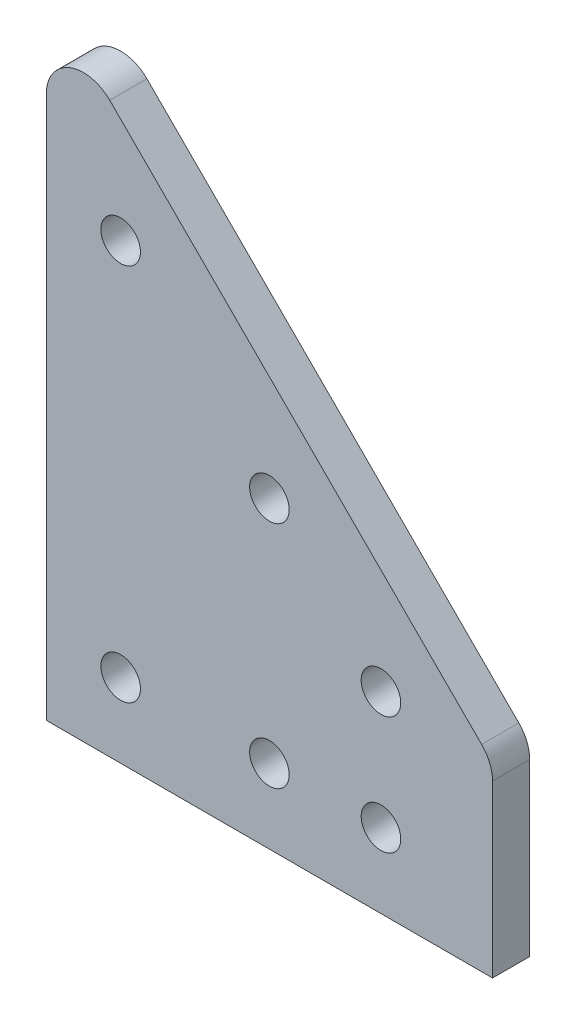
ISO-10303-21;
HEADER;
FILE_DESCRIPTION(('STEP AP214'),'2;1');
FILE_NAME('part.step','',(''),(''),'','','');
FILE_SCHEMA(('AUTOMOTIVE_DESIGN { 1 0 10303 214 1 1 1 1 }'));
ENDSEC;
DATA;
#1=APPLICATION_CONTEXT('core data for automotive mechanical design processes');
#2=APPLICATION_PROTOCOL_DEFINITION('international standard','automotive_design',2000,#1);
#3=PRODUCT_CONTEXT('',#1,'mechanical');
#4=PRODUCT('Part','Part','',(#3));
#5=PRODUCT_RELATED_PRODUCT_CATEGORY('part','',(#4));
#6=PRODUCT_DEFINITION_FORMATION('','',#4);
#7=PRODUCT_DEFINITION_CONTEXT('part definition',#1,'design');
#8=PRODUCT_DEFINITION('design','',#6,#7);
#9=PRODUCT_DEFINITION_SHAPE('','',#8);
#10=(LENGTH_UNIT() NAMED_UNIT(*) SI_UNIT(.MILLI.,.METRE.));
#11=(NAMED_UNIT(*) PLANE_ANGLE_UNIT() SI_UNIT($,.RADIAN.));
#12=(NAMED_UNIT(*) SI_UNIT($,.STERADIAN.) SOLID_ANGLE_UNIT());
#13=UNCERTAINTY_MEASURE_WITH_UNIT(LENGTH_MEASURE(1.E-05),#10,'distance_accuracy_value','');
#14=(GEOMETRIC_REPRESENTATION_CONTEXT(3) GLOBAL_UNCERTAINTY_ASSIGNED_CONTEXT((#13)) GLOBAL_UNIT_ASSIGNED_CONTEXT((#10,
#11,#12)) REPRESENTATION_CONTEXT('',''));
#15=CARTESIAN_POINT('',(0.,0.,0.));
#16=DIRECTION('',(0.,0.,1.));
#17=DIRECTION('',(1.,0.,0.));
#18=AXIS2_PLACEMENT_3D('',#15,#16,#17);
#19=CARTESIAN_POINT('',(-38.1,92.0749999999997,3.175));
#20=DIRECTION('',(1.,0.,0.));
#21=DIRECTION('',(0.,1.,0.));
#22=AXIS2_PLACEMENT_3D('',#19,#20,#21);
#23=PLANE('',#22);
#24=DIRECTION('',(0.,-1.,0.));
#25=VECTOR('',#24,1.);
#26=CARTESIAN_POINT('',(-38.1,92.0749999999997,3.175));
#27=LINE('',#26,#25);
#28=CARTESIAN_POINT('',(-38.1,76.7447438789306,3.175));
#29=VERTEX_POINT('',#28);
#30=CARTESIAN_POINT('',(-38.1,-15.875,3.175));
#31=VERTEX_POINT('',#30);
#32=EDGE_CURVE('E94',#29,#31,#27,.T.);
#33=ORIENTED_EDGE('',*,*,#32,.F.);
#34=DIRECTION('',(0.,0.,-1.));
#35=VECTOR('',#34,1.);
#36=CARTESIAN_POINT('',(-38.1,76.7447438789306,3.175));
#37=LINE('',#36,#35);
#38=CARTESIAN_POINT('',(-38.1,76.7447438789306,-3.175));
#39=VERTEX_POINT('',#38);
#40=EDGE_CURVE('E11',#29,#39,#37,.T.);
#41=ORIENTED_EDGE('',*,*,#40,.T.);
#42=DIRECTION('',(0.,-1.,0.));
#43=VECTOR('',#42,1.);
#44=CARTESIAN_POINT('',(-38.1,92.0749999999997,-3.175));
#45=LINE('',#44,#43);
#46=CARTESIAN_POINT('',(-38.1,-15.875,-3.175));
#47=VERTEX_POINT('',#46);
#48=EDGE_CURVE('E113',#39,#47,#45,.T.);
#49=ORIENTED_EDGE('',*,*,#48,.T.);
#50=DIRECTION('',(0.,0.,-1.));
#51=VECTOR('',#50,1.);
#52=CARTESIAN_POINT('',(-38.1,-15.875,3.175));
#53=LINE('',#52,#51);
#54=EDGE_CURVE('E107',#31,#47,#53,.T.);
#55=ORIENTED_EDGE('',*,*,#54,.F.);
#56=EDGE_LOOP('',(#33,#41,#49,#55));
#57=FACE_BOUND('',#56,.T.);
#58=ADVANCED_FACE('F41',(#57),#23,.F.);
#59=CARTESIAN_POINT('',(-38.1,-15.875,3.175));
#60=DIRECTION('',(0.,1.,0.));
#61=DIRECTION('',(0.,0.,1.));
#62=AXIS2_PLACEMENT_3D('',#59,#60,#61);
#63=PLANE('',#62);
#64=DIRECTION('',(1.,0.,0.));
#65=VECTOR('',#64,1.);
#66=CARTESIAN_POINT('',(-38.1,-15.875,-3.175));
#67=LINE('',#66,#65);
#68=CARTESIAN_POINT('',(38.1,-15.875,-3.175));
#69=VERTEX_POINT('',#68);
#70=EDGE_CURVE('E146',#47,#69,#67,.T.);
#71=ORIENTED_EDGE('',*,*,#70,.T.);
#72=DIRECTION('',(0.,0.,-1.));
#73=VECTOR('',#72,1.);
#74=CARTESIAN_POINT('',(38.1,-15.875,3.175));
#75=LINE('',#74,#73);
#76=CARTESIAN_POINT('',(38.1,-15.875,3.175));
#77=VERTEX_POINT('',#76);
#78=EDGE_CURVE('E109',#77,#69,#75,.T.);
#79=ORIENTED_EDGE('',*,*,#78,.F.);
#80=DIRECTION('',(1.,0.,0.));
#81=VECTOR('',#80,1.);
#82=CARTESIAN_POINT('',(-38.1,-15.875,3.175));
#83=LINE('',#82,#81);
#84=EDGE_CURVE('E97',#31,#77,#83,.T.);
#85=ORIENTED_EDGE('',*,*,#84,.F.);
#86=ORIENTED_EDGE('',*,*,#54,.T.);
#87=EDGE_LOOP('',(#71,#79,#85,#86));
#88=FACE_BOUND('',#87,.T.);
#89=ADVANCED_FACE('F106',(#88),#63,.F.);
#90=CARTESIAN_POINT('',(38.1,-15.875,3.175));
#91=DIRECTION('',(-1.,0.,0.));
#92=DIRECTION('',(0.,0.,1.));
#93=AXIS2_PLACEMENT_3D('',#90,#91,#92);
#94=PLANE('',#93);
#95=DIRECTION('',(0.,1.,0.));
#96=VECTOR('',#95,1.);
#97=CARTESIAN_POINT('',(38.1,-15.875,-3.175));
#98=LINE('',#97,#96);
#99=CARTESIAN_POINT('',(38.1,13.2447438789309,-3.175));
#100=VERTEX_POINT('',#99);
#101=EDGE_CURVE('E144',#69,#100,#98,.T.);
#102=ORIENTED_EDGE('',*,*,#101,.T.);
#103=DIRECTION('',(0.,0.,-1.));
#104=VECTOR('',#103,1.);
#105=CARTESIAN_POINT('',(38.1,13.2447438789309,3.175));
#106=LINE('',#105,#104);
#107=CARTESIAN_POINT('',(38.1,13.2447438789309,3.175));
#108=VERTEX_POINT('',#107);
#109=EDGE_CURVE('E64',#100,#108,#106,.F.);
#110=ORIENTED_EDGE('',*,*,#109,.T.);
#111=DIRECTION('',(0.,1.,0.));
#112=VECTOR('',#111,1.);
#113=CARTESIAN_POINT('',(38.1,-15.875,3.175));
#114=LINE('',#113,#112);
#115=EDGE_CURVE('E110',#77,#108,#114,.T.);
#116=ORIENTED_EDGE('',*,*,#115,.F.);
#117=ORIENTED_EDGE('',*,*,#78,.T.);
#118=EDGE_LOOP('',(#102,#110,#116,#117));
#119=FACE_BOUND('',#118,.T.);
#120=ADVANCED_FACE('F145',(#119),#94,.F.);
#121=CARTESIAN_POINT('',(38.1,15.875,3.175));
#122=DIRECTION('',(-0.707106781186546,-0.707106781186549,0.));
#123=DIRECTION('',(0.707106781186549,-0.707106781186546,0.));
#124=AXIS2_PLACEMENT_3D('',#121,#122,#123);
#125=PLANE('',#124);
#126=DIRECTION('',(-0.707106781186549,0.707106781186546,0.));
#127=VECTOR('',#126,1.);
#128=CARTESIAN_POINT('',(38.1,15.875,3.175));
#129=LINE('',#128,#127);
#130=CARTESIAN_POINT('',(36.2401280605346,17.7348719394654,3.175));
#131=VERTEX_POINT('',#130);
#132=CARTESIAN_POINT('',(-27.2598719394654,81.2348719394652,3.175));
#133=VERTEX_POINT('',#132);
#134=EDGE_CURVE('E119',#131,#133,#129,.T.);
#135=ORIENTED_EDGE('',*,*,#134,.F.);
#136=DIRECTION('',(0.,0.,-1.));
#137=VECTOR('',#136,1.);
#138=CARTESIAN_POINT('',(36.2401280605346,17.7348719394654,3.175));
#139=LINE('',#138,#137);
#140=CARTESIAN_POINT('',(36.2401280605346,17.7348719394654,-3.175));
#141=VERTEX_POINT('',#140);
#142=EDGE_CURVE('E117',#131,#141,#139,.T.);
#143=ORIENTED_EDGE('',*,*,#142,.T.);
#144=DIRECTION('',(-0.707106781186549,0.707106781186546,0.));
#145=VECTOR('',#144,1.);
#146=CARTESIAN_POINT('',(38.1,15.875,-3.175));
#147=LINE('',#146,#145);
#148=CARTESIAN_POINT('',(-27.2598719394654,81.2348719394652,-3.175));
#149=VERTEX_POINT('',#148);
#150=EDGE_CURVE('E102',#141,#149,#147,.T.);
#151=ORIENTED_EDGE('',*,*,#150,.T.);
#152=DIRECTION('',(0.,0.,-1.));
#153=VECTOR('',#152,1.);
#154=CARTESIAN_POINT('',(-27.2598719394655,81.2348719394652,3.175));
#155=LINE('',#154,#153);
#156=EDGE_CURVE('E115',#149,#133,#155,.F.);
#157=ORIENTED_EDGE('',*,*,#156,.T.);
#158=EDGE_LOOP('',(#135,#143,#151,#157));
#159=FACE_BOUND('',#158,.T.);
#160=ADVANCED_FACE('F135',(#159),#125,.F.);
#161=CARTESIAN_POINT('',(0.,0.,3.175));
#162=DIRECTION('',(0.,0.,1.));
#163=DIRECTION('',(1.,0.,0.));
#164=AXIS2_PLACEMENT_3D('',#161,#162,#163);
#165=PLANE('',#164);
#166=CARTESIAN_POINT('',(-25.4,61.4144877578617,3.175));
#167=DIRECTION('',(0.,0.,1.));
#168=DIRECTION('',(1.,0.,0.));
#169=AXIS2_PLACEMENT_3D('',#166,#167,#168);
#170=CIRCLE('',#169,3.37819999999999);
#171=CARTESIAN_POINT('',(-22.0218,61.4144877578617,3.175));
#172=VERTEX_POINT('',#171);
#173=EDGE_CURVE('E185',#172,#172,#170,.T.);
#174=ORIENTED_EDGE('',*,*,#173,.F.);
#175=EDGE_LOOP('',(#174));
#176=FACE_BOUND('',#175,.T.);
#177=CARTESIAN_POINT('',(0.,36.0144877578617,3.175));
#178=DIRECTION('',(0.,0.,1.));
#179=DIRECTION('',(1.,0.,0.));
#180=AXIS2_PLACEMENT_3D('',#177,#178,#179);
#181=CIRCLE('',#180,3.37819999999999);
#182=CARTESIAN_POINT('',(3.37819999999998,36.0144877578617,3.175));
#183=VERTEX_POINT('',#182);
#184=EDGE_CURVE('E179',#183,#183,#181,.T.);
#185=ORIENTED_EDGE('',*,*,#184,.F.);
#186=EDGE_LOOP('',(#185));
#187=FACE_BOUND('',#186,.T.);
#188=CARTESIAN_POINT('',(19.05,16.9644877578617,3.175));
#189=DIRECTION('',(0.,0.,1.));
#190=DIRECTION('',(1.,0.,0.));
#191=AXIS2_PLACEMENT_3D('',#188,#189,#190);
#192=CIRCLE('',#191,3.37819999999999);
#193=CARTESIAN_POINT('',(22.4282,16.9644877578617,3.175));
#194=VERTEX_POINT('',#193);
#195=EDGE_CURVE('E173',#194,#194,#192,.T.);
#196=ORIENTED_EDGE('',*,*,#195,.F.);
#197=EDGE_LOOP('',(#196));
#198=FACE_BOUND('',#197,.T.);
#199=CARTESIAN_POINT('',(-25.4,-3.175,3.175));
#200=DIRECTION('',(0.,0.,1.));
#201=DIRECTION('',(1.,0.,0.));
#202=AXIS2_PLACEMENT_3D('',#199,#200,#201);
#203=CIRCLE('',#202,3.37819999999999);
#204=CARTESIAN_POINT('',(-22.0218,-3.175,3.175));
#205=VERTEX_POINT('',#204);
#206=EDGE_CURVE('E167',#205,#205,#203,.T.);
#207=ORIENTED_EDGE('',*,*,#206,.F.);
#208=EDGE_LOOP('',(#207));
#209=FACE_BOUND('',#208,.T.);
#210=CARTESIAN_POINT('',(19.05,-3.175,3.175));
#211=DIRECTION('',(0.,0.,1.));
#212=DIRECTION('',(1.,0.,0.));
#213=AXIS2_PLACEMENT_3D('',#210,#211,#212);
#214=CIRCLE('',#213,3.37819999999999);
#215=CARTESIAN_POINT('',(22.4282,-3.175,3.175));
#216=VERTEX_POINT('',#215);
#217=EDGE_CURVE('E161',#216,#216,#214,.T.);
#218=ORIENTED_EDGE('',*,*,#217,.F.);
#219=EDGE_LOOP('',(#218));
#220=FACE_BOUND('',#219,.T.);
#221=CARTESIAN_POINT('',(0.,-3.175,3.175));
#222=DIRECTION('',(0.,0.,1.));
#223=DIRECTION('',(1.,0.,0.));
#224=AXIS2_PLACEMENT_3D('',#221,#222,#223);
#225=CIRCLE('',#224,3.37819999999999);
#226=CARTESIAN_POINT('',(3.37819999999998,-3.175,3.175));
#227=VERTEX_POINT('',#226);
#228=EDGE_CURVE('E155',#227,#227,#225,.T.);
#229=ORIENTED_EDGE('',*,*,#228,.F.);
#230=EDGE_LOOP('',(#229));
#231=FACE_BOUND('',#230,.T.);
#232=ORIENTED_EDGE('',*,*,#115,.T.);
#233=CARTESIAN_POINT('',(31.75,13.2447438789309,3.175));
#234=DIRECTION('',(0.,0.,1.));
#235=DIRECTION('',(1.,0.,0.));
#236=AXIS2_PLACEMENT_3D('',#233,#234,#235);
#237=CIRCLE('',#236,6.35);
#238=EDGE_CURVE('E49',#108,#131,#237,.T.);
#239=ORIENTED_EDGE('',*,*,#238,.T.);
#240=ORIENTED_EDGE('',*,*,#134,.T.);
#241=CARTESIAN_POINT('',(-31.75,76.7447438789306,3.175));
#242=DIRECTION('',(0.,0.,1.));
#243=DIRECTION('',(1.,0.,0.));
#244=AXIS2_PLACEMENT_3D('',#241,#242,#243);
#245=CIRCLE('',#244,6.35);
#246=EDGE_CURVE('E56',#133,#29,#245,.T.);
#247=ORIENTED_EDGE('',*,*,#246,.T.);
#248=ORIENTED_EDGE('',*,*,#32,.T.);
#249=ORIENTED_EDGE('',*,*,#84,.T.);
#250=EDGE_LOOP('',(#232,#239,#240,#247,#248,#249));
#251=FACE_BOUND('',#250,.T.);
#252=ADVANCED_FACE('F96',(#176,#187,#198,#209,#220,#231,#251),#165,.T.);
#253=CARTESIAN_POINT('',(0.,0.,-3.175));
#254=DIRECTION('',(0.,0.,1.));
#255=DIRECTION('',(1.,0.,0.));
#256=AXIS2_PLACEMENT_3D('',#253,#254,#255);
#257=PLANE('',#256);
#258=CARTESIAN_POINT('',(-25.4,61.4144877578617,-3.17499999999999));
#259=DIRECTION('',(0.,0.,1.));
#260=DIRECTION('',(1.,0.,0.));
#261=AXIS2_PLACEMENT_3D('',#258,#259,#260);
#262=CIRCLE('',#261,3.37819999999999);
#263=CARTESIAN_POINT('',(-22.0218,61.4144877578617,-3.17499999999999));
#264=VERTEX_POINT('',#263);
#265=EDGE_CURVE('E182',#264,#264,#262,.T.);
#266=ORIENTED_EDGE('',*,*,#265,.T.);
#267=EDGE_LOOP('',(#266));
#268=FACE_BOUND('',#267,.T.);
#269=CARTESIAN_POINT('',(0.,36.0144877578617,-3.17499999999999));
#270=DIRECTION('',(0.,0.,1.));
#271=DIRECTION('',(1.,0.,0.));
#272=AXIS2_PLACEMENT_3D('',#269,#270,#271);
#273=CIRCLE('',#272,3.37819999999999);
#274=CARTESIAN_POINT('',(3.37819999999998,36.0144877578617,-3.17499999999999));
#275=VERTEX_POINT('',#274);
#276=EDGE_CURVE('E176',#275,#275,#273,.T.);
#277=ORIENTED_EDGE('',*,*,#276,.T.);
#278=EDGE_LOOP('',(#277));
#279=FACE_BOUND('',#278,.T.);
#280=CARTESIAN_POINT('',(19.05,16.9644877578617,-3.17499999999999));
#281=DIRECTION('',(0.,0.,1.));
#282=DIRECTION('',(1.,0.,0.));
#283=AXIS2_PLACEMENT_3D('',#280,#281,#282);
#284=CIRCLE('',#283,3.37819999999999);
#285=CARTESIAN_POINT('',(22.4282,16.9644877578617,-3.17499999999999));
#286=VERTEX_POINT('',#285);
#287=EDGE_CURVE('E170',#286,#286,#284,.T.);
#288=ORIENTED_EDGE('',*,*,#287,.T.);
#289=EDGE_LOOP('',(#288));
#290=FACE_BOUND('',#289,.T.);
#291=CARTESIAN_POINT('',(-25.4,-3.175,-3.17499999999999));
#292=DIRECTION('',(0.,0.,1.));
#293=DIRECTION('',(1.,0.,0.));
#294=AXIS2_PLACEMENT_3D('',#291,#292,#293);
#295=CIRCLE('',#294,3.37819999999999);
#296=CARTESIAN_POINT('',(-22.0218,-3.175,-3.17499999999999));
#297=VERTEX_POINT('',#296);
#298=EDGE_CURVE('E164',#297,#297,#295,.T.);
#299=ORIENTED_EDGE('',*,*,#298,.T.);
#300=EDGE_LOOP('',(#299));
#301=FACE_BOUND('',#300,.T.);
#302=CARTESIAN_POINT('',(19.05,-3.175,-3.17499999999999));
#303=DIRECTION('',(0.,0.,1.));
#304=DIRECTION('',(1.,0.,0.));
#305=AXIS2_PLACEMENT_3D('',#302,#303,#304);
#306=CIRCLE('',#305,3.37819999999999);
#307=CARTESIAN_POINT('',(22.4282,-3.175,-3.17499999999999));
#308=VERTEX_POINT('',#307);
#309=EDGE_CURVE('E158',#308,#308,#306,.T.);
#310=ORIENTED_EDGE('',*,*,#309,.T.);
#311=EDGE_LOOP('',(#310));
#312=FACE_BOUND('',#311,.T.);
#313=CARTESIAN_POINT('',(0.,-3.175,-3.17499999999999));
#314=DIRECTION('',(0.,0.,1.));
#315=DIRECTION('',(1.,0.,0.));
#316=AXIS2_PLACEMENT_3D('',#313,#314,#315);
#317=CIRCLE('',#316,3.37819999999999);
#318=CARTESIAN_POINT('',(3.37819999999998,-3.175,-3.17499999999999));
#319=VERTEX_POINT('',#318);
#320=EDGE_CURVE('E150',#319,#319,#317,.T.);
#321=ORIENTED_EDGE('',*,*,#320,.T.);
#322=EDGE_LOOP('',(#321));
#323=FACE_BOUND('',#322,.T.);
#324=ORIENTED_EDGE('',*,*,#150,.F.);
#325=CARTESIAN_POINT('',(31.75,13.2447438789309,-3.175));
#326=DIRECTION('',(0.,0.,1.));
#327=DIRECTION('',(1.,0.,0.));
#328=AXIS2_PLACEMENT_3D('',#325,#326,#327);
#329=CIRCLE('',#328,6.35);
#330=EDGE_CURVE('E127',#141,#100,#329,.F.);
#331=ORIENTED_EDGE('',*,*,#330,.T.);
#332=ORIENTED_EDGE('',*,*,#101,.F.);
#333=ORIENTED_EDGE('',*,*,#70,.F.);
#334=ORIENTED_EDGE('',*,*,#48,.F.);
#335=CARTESIAN_POINT('',(-31.75,76.7447438789306,-3.175));
#336=DIRECTION('',(0.,0.,1.));
#337=DIRECTION('',(1.,0.,0.));
#338=AXIS2_PLACEMENT_3D('',#335,#336,#337);
#339=CIRCLE('',#338,6.35);
#340=EDGE_CURVE('E125',#39,#149,#339,.F.);
#341=ORIENTED_EDGE('',*,*,#340,.T.);
#342=EDGE_LOOP('',(#324,#331,#332,#333,#334,#341));
#343=FACE_BOUND('',#342,.T.);
#344=ADVANCED_FACE('F143',(#268,#279,#290,#301,#312,#323,#343),#257,.F.);
#345=CARTESIAN_POINT('',(0.,-3.175,3.175));
#346=DIRECTION('',(0.,0.,1.));
#347=DIRECTION('',(1.,0.,0.));
#348=AXIS2_PLACEMENT_3D('',#345,#346,#347);
#349=CYLINDRICAL_SURFACE('',#348,3.37819999999999);
#350=ORIENTED_EDGE('',*,*,#320,.F.);
#351=EDGE_LOOP('',(#350));
#352=FACE_BOUND('',#351,.T.);
#353=ORIENTED_EDGE('',*,*,#228,.T.);
#354=EDGE_LOOP('',(#353));
#355=FACE_BOUND('',#354,.T.);
#356=ADVANCED_FACE('F204',(#352,#355),#349,.F.);
#357=CARTESIAN_POINT('',(19.05,-3.175,3.175));
#358=DIRECTION('',(0.,0.,1.));
#359=DIRECTION('',(1.,0.,0.));
#360=AXIS2_PLACEMENT_3D('',#357,#358,#359);
#361=CYLINDRICAL_SURFACE('',#360,3.37819999999999);
#362=ORIENTED_EDGE('',*,*,#309,.F.);
#363=EDGE_LOOP('',(#362));
#364=FACE_BOUND('',#363,.T.);
#365=ORIENTED_EDGE('',*,*,#217,.T.);
#366=EDGE_LOOP('',(#365));
#367=FACE_BOUND('',#366,.T.);
#368=ADVANCED_FACE('F206',(#364,#367),#361,.F.);
#369=CARTESIAN_POINT('',(-25.4,-3.175,3.175));
#370=DIRECTION('',(0.,0.,1.));
#371=DIRECTION('',(1.,0.,0.));
#372=AXIS2_PLACEMENT_3D('',#369,#370,#371);
#373=CYLINDRICAL_SURFACE('',#372,3.37819999999999);
#374=ORIENTED_EDGE('',*,*,#298,.F.);
#375=EDGE_LOOP('',(#374));
#376=FACE_BOUND('',#375,.T.);
#377=ORIENTED_EDGE('',*,*,#206,.T.);
#378=EDGE_LOOP('',(#377));
#379=FACE_BOUND('',#378,.T.);
#380=ADVANCED_FACE('F213',(#376,#379),#373,.F.);
#381=CARTESIAN_POINT('',(19.05,16.9644877578617,3.175));
#382=DIRECTION('',(0.,0.,1.));
#383=DIRECTION('',(1.,0.,0.));
#384=AXIS2_PLACEMENT_3D('',#381,#382,#383);
#385=CYLINDRICAL_SURFACE('',#384,3.37819999999999);
#386=ORIENTED_EDGE('',*,*,#287,.F.);
#387=EDGE_LOOP('',(#386));
#388=FACE_BOUND('',#387,.T.);
#389=ORIENTED_EDGE('',*,*,#195,.T.);
#390=EDGE_LOOP('',(#389));
#391=FACE_BOUND('',#390,.T.);
#392=ADVANCED_FACE('F239',(#388,#391),#385,.F.);
#393=CARTESIAN_POINT('',(0.,36.0144877578617,3.175));
#394=DIRECTION('',(0.,0.,1.));
#395=DIRECTION('',(1.,0.,0.));
#396=AXIS2_PLACEMENT_3D('',#393,#394,#395);
#397=CYLINDRICAL_SURFACE('',#396,3.37819999999999);
#398=ORIENTED_EDGE('',*,*,#276,.F.);
#399=EDGE_LOOP('',(#398));
#400=FACE_BOUND('',#399,.T.);
#401=ORIENTED_EDGE('',*,*,#184,.T.);
#402=EDGE_LOOP('',(#401));
#403=FACE_BOUND('',#402,.T.);
#404=ADVANCED_FACE('F233',(#400,#403),#397,.F.);
#405=CARTESIAN_POINT('',(-25.4,61.4144877578617,3.175));
#406=DIRECTION('',(0.,0.,1.));
#407=DIRECTION('',(1.,0.,0.));
#408=AXIS2_PLACEMENT_3D('',#405,#406,#407);
#409=CYLINDRICAL_SURFACE('',#408,3.37819999999999);
#410=ORIENTED_EDGE('',*,*,#265,.F.);
#411=EDGE_LOOP('',(#410));
#412=FACE_BOUND('',#411,.T.);
#413=ORIENTED_EDGE('',*,*,#173,.T.);
#414=EDGE_LOOP('',(#413));
#415=FACE_BOUND('',#414,.T.);
#416=ADVANCED_FACE('F189',(#412,#415),#409,.F.);
#417=CARTESIAN_POINT('',(31.75,13.2447438789309,3.175));
#418=DIRECTION('',(0.,0.,-1.));
#419=DIRECTION('',(-1.,0.,0.));
#420=AXIS2_PLACEMENT_3D('',#417,#418,#419);
#421=CYLINDRICAL_SURFACE('',#420,6.35);
#422=ORIENTED_EDGE('',*,*,#238,.F.);
#423=ORIENTED_EDGE('',*,*,#109,.F.);
#424=ORIENTED_EDGE('',*,*,#330,.F.);
#425=ORIENTED_EDGE('',*,*,#142,.F.);
#426=EDGE_LOOP('',(#422,#423,#424,#425));
#427=FACE_BOUND('',#426,.T.);
#428=ADVANCED_FACE('F140',(#427),#421,.T.);
#429=CARTESIAN_POINT('',(-31.75,76.7447438789306,3.175));
#430=DIRECTION('',(0.,0.,-1.));
#431=DIRECTION('',(-1.,0.,0.));
#432=AXIS2_PLACEMENT_3D('',#429,#430,#431);
#433=CYLINDRICAL_SURFACE('',#432,6.35);
#434=ORIENTED_EDGE('',*,*,#246,.F.);
#435=ORIENTED_EDGE('',*,*,#156,.F.);
#436=ORIENTED_EDGE('',*,*,#340,.F.);
#437=ORIENTED_EDGE('',*,*,#40,.F.);
#438=EDGE_LOOP('',(#434,#435,#436,#437));
#439=FACE_BOUND('',#438,.T.);
#440=ADVANCED_FACE('F43',(#439),#433,.T.);
#441=CLOSED_SHELL('',(#58,#89,#120,#160,#252,#344,#356,#368,#380,#392,#404,#416,#428,#440));
#442=MANIFOLD_SOLID_BREP('B2',#441);
#443=ADVANCED_BREP_SHAPE_REPRESENTATION('',(#18,#442),#14);
#444=SHAPE_DEFINITION_REPRESENTATION(#9,#443);
ENDSEC;
END-ISO-10303-21;
